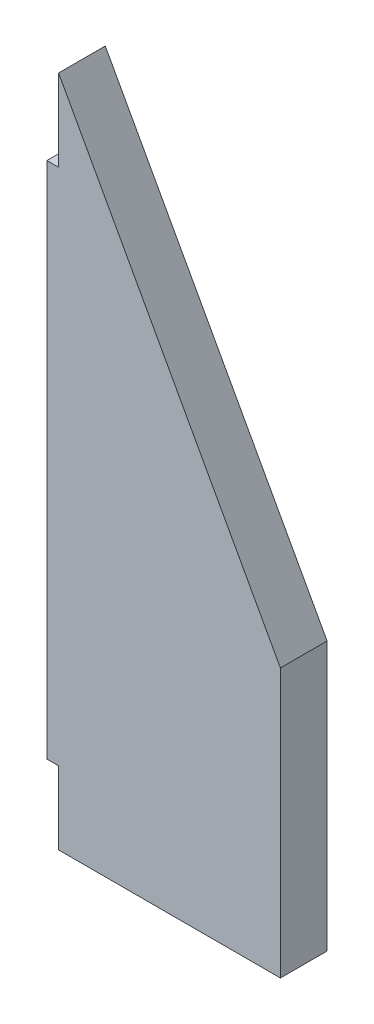
ISO-10303-21;
HEADER;
FILE_DESCRIPTION(('STEP AP214'),'2;1');
FILE_NAME('part.step','',(''),(''),'','','');
FILE_SCHEMA(('AUTOMOTIVE_DESIGN { 1 0 10303 214 1 1 1 1 }'));
ENDSEC;
DATA;
#1=APPLICATION_CONTEXT('core data for automotive mechanical design processes');
#2=APPLICATION_PROTOCOL_DEFINITION('international standard','automotive_design',2000,#1);
#3=PRODUCT_CONTEXT('',#1,'mechanical');
#4=PRODUCT('Part','Part','',(#3));
#5=PRODUCT_RELATED_PRODUCT_CATEGORY('part','',(#4));
#6=PRODUCT_DEFINITION_FORMATION('','',#4);
#7=PRODUCT_DEFINITION_CONTEXT('part definition',#1,'design');
#8=PRODUCT_DEFINITION('design','',#6,#7);
#9=PRODUCT_DEFINITION_SHAPE('','',#8);
#10=(LENGTH_UNIT() NAMED_UNIT(*) SI_UNIT(.MILLI.,.METRE.));
#11=(NAMED_UNIT(*) PLANE_ANGLE_UNIT() SI_UNIT($,.RADIAN.));
#12=(NAMED_UNIT(*) SI_UNIT($,.STERADIAN.) SOLID_ANGLE_UNIT());
#13=UNCERTAINTY_MEASURE_WITH_UNIT(LENGTH_MEASURE(1.E-05),#10,'distance_accuracy_value','');
#14=(GEOMETRIC_REPRESENTATION_CONTEXT(3) GLOBAL_UNCERTAINTY_ASSIGNED_CONTEXT((#13)) GLOBAL_UNIT_ASSIGNED_CONTEXT((#10,
#11,#12)) REPRESENTATION_CONTEXT('',''));
#15=CARTESIAN_POINT('',(0.,0.,0.));
#16=DIRECTION('',(0.,0.,1.));
#17=DIRECTION('',(1.,0.,0.));
#18=AXIS2_PLACEMENT_3D('',#15,#16,#17);
#19=CARTESIAN_POINT('',(-2.32839165217279,128.626315582831,10.16));
#20=DIRECTION('',(1.,0.,0.));
#21=DIRECTION('',(0.,1.,0.));
#22=AXIS2_PLACEMENT_3D('',#19,#20,#21);
#23=PLANE('',#22);
#24=DIRECTION('',(0.,-1.,0.));
#25=VECTOR('',#24,1.);
#26=CARTESIAN_POINT('',(-2.32839165217279,128.626315582831,0.));
#27=LINE('',#26,#25);
#28=CARTESIAN_POINT('',(-2.32839165217279,128.626315582831,0.));
#29=VERTEX_POINT('',#28);
#30=CARTESIAN_POINT('',(-2.32839165217277,15.8503155828312,0.));
#31=VERTEX_POINT('',#30);
#32=EDGE_CURVE('E140',#29,#31,#27,.T.);
#33=ORIENTED_EDGE('',*,*,#32,.T.);
#34=DIRECTION('',(0.,0.,-1.));
#35=VECTOR('',#34,1.);
#36=CARTESIAN_POINT('',(-2.32839165217277,15.8503155828312,10.16));
#37=LINE('',#36,#35);
#38=CARTESIAN_POINT('',(-2.32839165217277,15.8503155828312,10.16));
#39=VERTEX_POINT('',#38);
#40=EDGE_CURVE('E11',#39,#31,#37,.T.);
#41=ORIENTED_EDGE('',*,*,#40,.F.);
#42=DIRECTION('',(0.,-1.,0.));
#43=VECTOR('',#42,1.);
#44=CARTESIAN_POINT('',(-2.32839165217279,128.626315582831,10.16));
#45=LINE('',#44,#43);
#46=CARTESIAN_POINT('',(-2.32839165217279,128.626315582831,10.16));
#47=VERTEX_POINT('',#46);
#48=EDGE_CURVE('E162',#47,#39,#45,.T.);
#49=ORIENTED_EDGE('',*,*,#48,.F.);
#50=DIRECTION('',(0.,0.,-1.));
#51=VECTOR('',#50,1.);
#52=CARTESIAN_POINT('',(-2.32839165217279,128.626315582831,10.16));
#53=LINE('',#52,#51);
#54=EDGE_CURVE('E136',#47,#29,#53,.T.);
#55=ORIENTED_EDGE('',*,*,#54,.T.);
#56=EDGE_LOOP('',(#33,#41,#49,#55));
#57=FACE_BOUND('',#56,.T.);
#58=ADVANCED_FACE('F39',(#57),#23,.F.);
#59=CARTESIAN_POINT('',(-2.32839165217277,15.8503155828312,10.16));
#60=DIRECTION('',(0.,1.,0.));
#61=DIRECTION('',(0.,0.,1.));
#62=AXIS2_PLACEMENT_3D('',#59,#60,#61);
#63=PLANE('',#62);
#64=DIRECTION('',(1.,0.,0.));
#65=VECTOR('',#64,1.);
#66=CARTESIAN_POINT('',(-2.32839165217277,15.8503155828312,0.));
#67=LINE('',#66,#65);
#68=CARTESIAN_POINT('',(0.211608347827226,15.8503155828312,0.));
#69=VERTEX_POINT('',#68);
#70=EDGE_CURVE('E144',#31,#69,#67,.T.);
#71=ORIENTED_EDGE('',*,*,#70,.T.);
#72=DIRECTION('',(0.,0.,-1.));
#73=VECTOR('',#72,1.);
#74=CARTESIAN_POINT('',(0.211608347827226,15.8503155828312,10.16));
#75=LINE('',#74,#73);
#76=CARTESIAN_POINT('',(0.211608347827226,15.8503155828312,10.16));
#77=VERTEX_POINT('',#76);
#78=EDGE_CURVE('E48',#77,#69,#75,.T.);
#79=ORIENTED_EDGE('',*,*,#78,.F.);
#80=DIRECTION('',(1.,0.,0.));
#81=VECTOR('',#80,1.);
#82=CARTESIAN_POINT('',(-2.32839165217277,15.8503155828312,10.16));
#83=LINE('',#82,#81);
#84=EDGE_CURVE('E99',#39,#77,#83,.T.);
#85=ORIENTED_EDGE('',*,*,#84,.F.);
#86=ORIENTED_EDGE('',*,*,#40,.T.);
#87=EDGE_LOOP('',(#71,#79,#85,#86));
#88=FACE_BOUND('',#87,.T.);
#89=ADVANCED_FACE('F208',(#88),#63,.F.);
#90=CARTESIAN_POINT('',(0.211608347827226,15.8503155828312,10.16));
#91=DIRECTION('',(1.,0.,0.));
#92=DIRECTION('',(0.,1.,0.));
#93=AXIS2_PLACEMENT_3D('',#90,#91,#92);
#94=PLANE('',#93);
#95=DIRECTION('',(0.,-1.,0.));
#96=VECTOR('',#95,1.);
#97=CARTESIAN_POINT('',(0.211608347827226,15.8503155828312,0.));
#98=LINE('',#97,#96);
#99=CARTESIAN_POINT('',(0.211608347827228,0.,0.));
#100=VERTEX_POINT('',#99);
#101=EDGE_CURVE('E147',#69,#100,#98,.T.);
#102=ORIENTED_EDGE('',*,*,#101,.T.);
#103=DIRECTION('',(0.,0.,-1.));
#104=VECTOR('',#103,1.);
#105=CARTESIAN_POINT('',(0.211608347827228,0.,10.16));
#106=LINE('',#105,#104);
#107=CARTESIAN_POINT('',(0.211608347827228,0.,10.16));
#108=VERTEX_POINT('',#107);
#109=EDGE_CURVE('E173',#108,#100,#106,.T.);
#110=ORIENTED_EDGE('',*,*,#109,.F.);
#111=DIRECTION('',(0.,-1.,0.));
#112=VECTOR('',#111,1.);
#113=CARTESIAN_POINT('',(0.211608347827226,15.8503155828312,10.16));
#114=LINE('',#113,#112);
#115=EDGE_CURVE('E183',#77,#108,#114,.T.);
#116=ORIENTED_EDGE('',*,*,#115,.F.);
#117=ORIENTED_EDGE('',*,*,#78,.T.);
#118=EDGE_LOOP('',(#102,#110,#116,#117));
#119=FACE_BOUND('',#118,.T.);
#120=ADVANCED_FACE('F181',(#119),#94,.F.);
#121=CARTESIAN_POINT('',(0.211608347827228,0.,10.16));
#122=DIRECTION('',(0.,1.,0.));
#123=DIRECTION('',(0.,0.,1.));
#124=AXIS2_PLACEMENT_3D('',#121,#122,#123);
#125=PLANE('',#124);
#126=DIRECTION('',(1.,0.,0.));
#127=VECTOR('',#126,1.);
#128=CARTESIAN_POINT('',(0.211608347827228,0.,0.));
#129=LINE('',#128,#127);
#130=CARTESIAN_POINT('',(48.4716083478272,0.,0.));
#131=VERTEX_POINT('',#130);
#132=EDGE_CURVE('E150',#100,#131,#129,.T.);
#133=ORIENTED_EDGE('',*,*,#132,.T.);
#134=DIRECTION('',(0.,0.,-1.));
#135=VECTOR('',#134,1.);
#136=CARTESIAN_POINT('',(48.4716083478272,0.,10.16));
#137=LINE('',#136,#135);
#138=CARTESIAN_POINT('',(48.4716083478272,0.,10.16));
#139=VERTEX_POINT('',#138);
#140=EDGE_CURVE('E169',#139,#131,#137,.T.);
#141=ORIENTED_EDGE('',*,*,#140,.F.);
#142=DIRECTION('',(1.,0.,0.));
#143=VECTOR('',#142,1.);
#144=CARTESIAN_POINT('',(0.211608347827228,0.,10.16));
#145=LINE('',#144,#143);
#146=EDGE_CURVE('E196',#108,#139,#145,.T.);
#147=ORIENTED_EDGE('',*,*,#146,.F.);
#148=ORIENTED_EDGE('',*,*,#109,.T.);
#149=EDGE_LOOP('',(#133,#141,#147,#148));
#150=FACE_BOUND('',#149,.T.);
#151=ADVANCED_FACE('F191',(#150),#125,.F.);
#152=CARTESIAN_POINT('',(48.4716083478272,0.,10.16));
#153=DIRECTION('',(-1.,0.,0.));
#154=DIRECTION('',(0.,0.,1.));
#155=AXIS2_PLACEMENT_3D('',#152,#153,#154);
#156=PLANE('',#155);
#157=DIRECTION('',(0.,1.,0.));
#158=VECTOR('',#157,1.);
#159=CARTESIAN_POINT('',(48.4716083478272,0.,0.));
#160=LINE('',#159,#158);
#161=CARTESIAN_POINT('',(48.4716083478272,58.42,0.));
#162=VERTEX_POINT('',#161);
#163=EDGE_CURVE('E153',#131,#162,#160,.T.);
#164=ORIENTED_EDGE('',*,*,#163,.T.);
#165=DIRECTION('',(0.,0.,-1.));
#166=VECTOR('',#165,1.);
#167=CARTESIAN_POINT('',(48.4716083478272,58.42,10.16));
#168=LINE('',#167,#166);
#169=CARTESIAN_POINT('',(48.4716083478272,58.42,10.16));
#170=VERTEX_POINT('',#169);
#171=EDGE_CURVE('E129',#170,#162,#168,.T.);
#172=ORIENTED_EDGE('',*,*,#171,.F.);
#173=DIRECTION('',(0.,1.,0.));
#174=VECTOR('',#173,1.);
#175=CARTESIAN_POINT('',(48.4716083478272,0.,10.16));
#176=LINE('',#175,#174);
#177=EDGE_CURVE('E118',#139,#170,#176,.T.);
#178=ORIENTED_EDGE('',*,*,#177,.F.);
#179=ORIENTED_EDGE('',*,*,#140,.T.);
#180=EDGE_LOOP('',(#164,#172,#178,#179));
#181=FACE_BOUND('',#180,.T.);
#182=ADVANCED_FACE('F194',(#181),#156,.F.);
#183=CARTESIAN_POINT('',(48.4716083478272,58.42,10.16));
#184=DIRECTION('',(-0.876738569385036,-0.480967234801581,0.));
#185=DIRECTION('',(0.480967234801582,-0.876738569385037,0.));
#186=AXIS2_PLACEMENT_3D('',#183,#184,#185);
#187=PLANE('',#186);
#188=DIRECTION('',(-0.480967234801581,0.876738569385036,0.));
#189=VECTOR('',#188,1.);
#190=CARTESIAN_POINT('',(48.4716083478272,58.42,0.));
#191=LINE('',#190,#189);
#192=CARTESIAN_POINT('',(0.21160834782721,146.391488070236,0.));
#193=VERTEX_POINT('',#192);
#194=EDGE_CURVE('E127',#162,#193,#191,.T.);
#195=ORIENTED_EDGE('',*,*,#194,.T.);
#196=DIRECTION('',(0.,0.,-1.));
#197=VECTOR('',#196,1.);
#198=CARTESIAN_POINT('',(0.21160834782721,146.391488070236,10.16));
#199=LINE('',#198,#197);
#200=CARTESIAN_POINT('',(0.21160834782721,146.391488070236,10.16));
#201=VERTEX_POINT('',#200);
#202=EDGE_CURVE('E124',#201,#193,#199,.T.);
#203=ORIENTED_EDGE('',*,*,#202,.F.);
#204=DIRECTION('',(-0.480967234801581,0.876738569385036,0.));
#205=VECTOR('',#204,1.);
#206=CARTESIAN_POINT('',(48.4716083478272,58.42,10.16));
#207=LINE('',#206,#205);
#208=EDGE_CURVE('E112',#170,#201,#207,.T.);
#209=ORIENTED_EDGE('',*,*,#208,.F.);
#210=ORIENTED_EDGE('',*,*,#171,.T.);
#211=EDGE_LOOP('',(#195,#203,#209,#210));
#212=FACE_BOUND('',#211,.T.);
#213=ADVANCED_FACE('F125',(#212),#187,.F.);
#214=CARTESIAN_POINT('',(0.21160834782721,146.391488070236,10.16));
#215=DIRECTION('',(1.,0.,0.));
#216=DIRECTION('',(0.,1.,0.));
#217=AXIS2_PLACEMENT_3D('',#214,#215,#216);
#218=PLANE('',#217);
#219=DIRECTION('',(0.,-1.,0.));
#220=VECTOR('',#219,1.);
#221=CARTESIAN_POINT('',(0.21160834782721,146.391488070236,0.));
#222=LINE('',#221,#220);
#223=CARTESIAN_POINT('',(0.211608347827212,128.626315582831,0.));
#224=VERTEX_POINT('',#223);
#225=EDGE_CURVE('E85',#193,#224,#222,.T.);
#226=ORIENTED_EDGE('',*,*,#225,.T.);
#227=DIRECTION('',(0.,0.,-1.));
#228=VECTOR('',#227,1.);
#229=CARTESIAN_POINT('',(0.211608347827212,128.626315582831,10.16));
#230=LINE('',#229,#228);
#231=CARTESIAN_POINT('',(0.211608347827212,128.626315582831,10.16));
#232=VERTEX_POINT('',#231);
#233=EDGE_CURVE('E130',#232,#224,#230,.T.);
#234=ORIENTED_EDGE('',*,*,#233,.F.);
#235=DIRECTION('',(0.,-1.,0.));
#236=VECTOR('',#235,1.);
#237=CARTESIAN_POINT('',(0.21160834782721,146.391488070236,10.16));
#238=LINE('',#237,#236);
#239=EDGE_CURVE('E116',#201,#232,#238,.T.);
#240=ORIENTED_EDGE('',*,*,#239,.F.);
#241=ORIENTED_EDGE('',*,*,#202,.T.);
#242=EDGE_LOOP('',(#226,#234,#240,#241));
#243=FACE_BOUND('',#242,.T.);
#244=ADVANCED_FACE('F132',(#243),#218,.F.);
#245=CARTESIAN_POINT('',(0.211608347827212,128.626315582831,10.16));
#246=DIRECTION('',(0.,-1.,0.));
#247=DIRECTION('',(0.,0.,-1.));
#248=AXIS2_PLACEMENT_3D('',#245,#246,#247);
#249=PLANE('',#248);
#250=DIRECTION('',(-1.,0.,0.));
#251=VECTOR('',#250,1.);
#252=CARTESIAN_POINT('',(0.211608347827212,128.626315582831,0.));
#253=LINE('',#252,#251);
#254=EDGE_CURVE('E91',#224,#29,#253,.T.);
#255=ORIENTED_EDGE('',*,*,#254,.T.);
#256=ORIENTED_EDGE('',*,*,#54,.F.);
#257=DIRECTION('',(-1.,0.,0.));
#258=VECTOR('',#257,1.);
#259=CARTESIAN_POINT('',(0.211608347827212,128.626315582831,10.16));
#260=LINE('',#259,#258);
#261=EDGE_CURVE('E56',#232,#47,#260,.T.);
#262=ORIENTED_EDGE('',*,*,#261,.F.);
#263=ORIENTED_EDGE('',*,*,#233,.T.);
#264=EDGE_LOOP('',(#255,#256,#262,#263));
#265=FACE_BOUND('',#264,.T.);
#266=ADVANCED_FACE('F224',(#265),#249,.F.);
#267=CARTESIAN_POINT('',(0.,0.,10.16));
#268=DIRECTION('',(0.,0.,1.));
#269=DIRECTION('',(1.,0.,0.));
#270=AXIS2_PLACEMENT_3D('',#267,#268,#269);
#271=PLANE('',#270);
#272=ORIENTED_EDGE('',*,*,#48,.T.);
#273=ORIENTED_EDGE('',*,*,#84,.T.);
#274=ORIENTED_EDGE('',*,*,#115,.T.);
#275=ORIENTED_EDGE('',*,*,#146,.T.);
#276=ORIENTED_EDGE('',*,*,#177,.T.);
#277=ORIENTED_EDGE('',*,*,#208,.T.);
#278=ORIENTED_EDGE('',*,*,#239,.T.);
#279=ORIENTED_EDGE('',*,*,#261,.T.);
#280=EDGE_LOOP('',(#272,#273,#274,#275,#276,#277,#278,#279));
#281=FACE_BOUND('',#280,.T.);
#282=ADVANCED_FACE('F114',(#281),#271,.T.);
#283=CARTESIAN_POINT('',(0.,0.,0.));
#284=DIRECTION('',(0.,0.,1.));
#285=DIRECTION('',(1.,0.,0.));
#286=AXIS2_PLACEMENT_3D('',#283,#284,#285);
#287=PLANE('',#286);
#288=ORIENTED_EDGE('',*,*,#32,.F.);
#289=ORIENTED_EDGE('',*,*,#254,.F.);
#290=ORIENTED_EDGE('',*,*,#225,.F.);
#291=ORIENTED_EDGE('',*,*,#194,.F.);
#292=ORIENTED_EDGE('',*,*,#163,.F.);
#293=ORIENTED_EDGE('',*,*,#132,.F.);
#294=ORIENTED_EDGE('',*,*,#101,.F.);
#295=ORIENTED_EDGE('',*,*,#70,.F.);
#296=EDGE_LOOP('',(#288,#289,#290,#291,#292,#293,#294,#295));
#297=FACE_BOUND('',#296,.T.);
#298=ADVANCED_FACE('F187',(#297),#287,.F.);
#299=CLOSED_SHELL('',(#58,#89,#120,#151,#182,#213,#244,#266,#282,#298));
#300=MANIFOLD_SOLID_BREP('B2',#299);
#301=ADVANCED_BREP_SHAPE_REPRESENTATION('',(#18,#300),#14);
#302=SHAPE_DEFINITION_REPRESENTATION(#9,#301);
ENDSEC;
END-ISO-10303-21;
